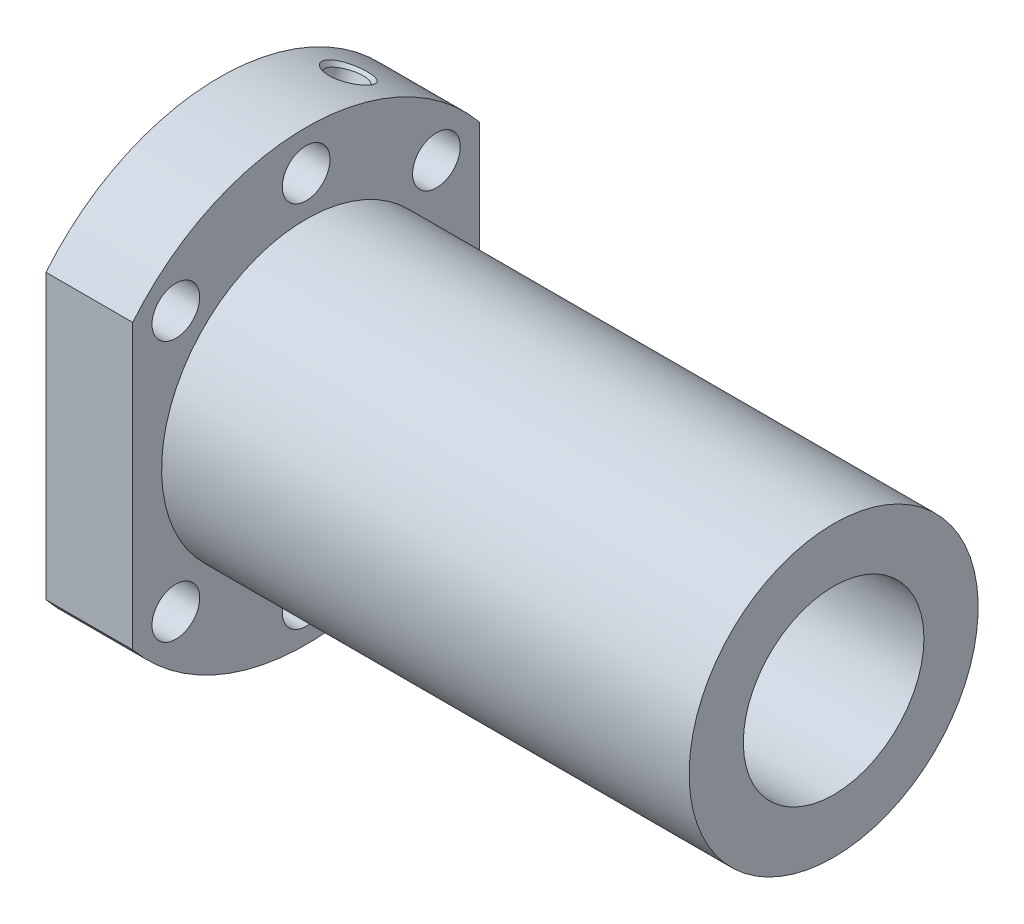
ISO-10303-21;
HEADER;
FILE_DESCRIPTION(('STEP AP214'),'2;1');
FILE_NAME('part.step','',(''),(''),'','','');
FILE_SCHEMA(('AUTOMOTIVE_DESIGN { 1 0 10303 214 1 1 1 1 }'));
ENDSEC;
DATA;
#1=APPLICATION_CONTEXT('core data for automotive mechanical design processes');
#2=APPLICATION_PROTOCOL_DEFINITION('international standard','automotive_design',2000,#1);
#3=PRODUCT_CONTEXT('',#1,'mechanical');
#4=PRODUCT('Part','Part','',(#3));
#5=PRODUCT_RELATED_PRODUCT_CATEGORY('part','',(#4));
#6=PRODUCT_DEFINITION_FORMATION('','',#4);
#7=PRODUCT_DEFINITION_CONTEXT('part definition',#1,'design');
#8=PRODUCT_DEFINITION('design','',#6,#7);
#9=PRODUCT_DEFINITION_SHAPE('','',#8);
#10=(LENGTH_UNIT() NAMED_UNIT(*) SI_UNIT(.MILLI.,.METRE.));
#11=(NAMED_UNIT(*) PLANE_ANGLE_UNIT() SI_UNIT($,.RADIAN.));
#12=(NAMED_UNIT(*) SI_UNIT($,.STERADIAN.) SOLID_ANGLE_UNIT());
#13=UNCERTAINTY_MEASURE_WITH_UNIT(LENGTH_MEASURE(1.E-05),#10,'distance_accuracy_value','');
#14=(GEOMETRIC_REPRESENTATION_CONTEXT(3) GLOBAL_UNCERTAINTY_ASSIGNED_CONTEXT((#13)) GLOBAL_UNIT_ASSIGNED_CONTEXT((#10,
#11,#12)) REPRESENTATION_CONTEXT('',''));
#15=CARTESIAN_POINT('',(0.,0.,0.));
#16=DIRECTION('',(0.,0.,1.));
#17=DIRECTION('',(1.,0.,0.));
#18=AXIS2_PLACEMENT_3D('',#15,#16,#17);
#19=CARTESIAN_POINT('',(0.,0.,0.));
#20=DIRECTION('',(1.,0.,0.));
#21=DIRECTION('',(0.,-1.,0.));
#22=AXIS2_PLACEMENT_3D('',#19,#20,#21);
#23=CYLINDRICAL_SURFACE('',#22,31.);
#24=CARTESIAN_POINT('',(0.,0.,0.));
#25=DIRECTION('',(1.,0.,0.));
#26=DIRECTION('',(0.,-1.,0.));
#27=AXIS2_PLACEMENT_3D('',#24,#25,#26);
#28=CIRCLE('',#27,31.);
#29=CARTESIAN_POINT('',(0.,19.6214168703486,-24.));
#30=VERTEX_POINT('',#29);
#31=CARTESIAN_POINT('',(0.,19.6214168703486,24.));
#32=VERTEX_POINT('',#31);
#33=EDGE_CURVE('E89',#30,#32,#28,.T.);
#34=ORIENTED_EDGE('',*,*,#33,.T.);
#35=DIRECTION('',(1.,0.,0.));
#36=VECTOR('',#35,1.);
#37=CARTESIAN_POINT('',(0.,19.6214168703486,24.));
#38=LINE('',#37,#36);
#39=CARTESIAN_POINT('',(12.,19.6214168703486,24.));
#40=VERTEX_POINT('',#39);
#41=EDGE_CURVE('E113',#32,#40,#38,.T.);
#42=ORIENTED_EDGE('',*,*,#41,.T.);
#43=CARTESIAN_POINT('',(12.,0.,0.));
#44=DIRECTION('',(-1.,0.,0.));
#45=DIRECTION('',(0.,-1.,0.));
#46=AXIS2_PLACEMENT_3D('',#43,#44,#45);
#47=CIRCLE('',#46,31.);
#48=CARTESIAN_POINT('',(12.,19.6214168703486,-24.));
#49=VERTEX_POINT('',#48);
#50=EDGE_CURVE('E80',#40,#49,#47,.T.);
#51=ORIENTED_EDGE('',*,*,#50,.T.);
#52=DIRECTION('',(1.,0.,0.));
#53=VECTOR('',#52,1.);
#54=CARTESIAN_POINT('',(0.,19.6214168703486,-24.));
#55=LINE('',#54,#53);
#56=EDGE_CURVE('E79',#49,#30,#55,.F.);
#57=ORIENTED_EDGE('',*,*,#56,.T.);
#58=EDGE_LOOP('',(#34,#42,#51,#57));
#59=FACE_BOUND('',#58,.T.);
#60=CARTESIAN_POINT('',(3.73391342266617,27.8690269486226,-13.5763521220967));
#61=CARTESIAN_POINT('',(3.83172039945811,27.8217427268872,-13.6734156455103));
#62=CARTESIAN_POINT('',(3.93764096271412,27.7771449125141,-13.7636744667535));
#63=CARTESIAN_POINT('',(4.16311193954464,27.6945830576614,-13.9290573607886));
#64=CARTESIAN_POINT('',(4.2826752949233,27.6566254040687,-14.004166872612));
#65=CARTESIAN_POINT('',(4.55093773970761,27.5834506969795,-14.1478156487867));
#66=CARTESIAN_POINT('',(4.70134328426315,27.5494398722502,-14.2138008167163));
#67=CARTESIAN_POINT('',(5.01220614490992,27.4927870995901,-14.3230744502846));
#68=CARTESIAN_POINT('',(5.17266645855808,27.4701485603092,-14.3663561111033));
#69=CARTESIAN_POINT('',(5.50471594787177,27.4365077497302,-14.4305030147486));
#70=CARTESIAN_POINT('',(5.6764974818161,27.4259106734008,-14.4505880326188));
#71=CARTESIAN_POINT('',(6.02145222803602,27.4181119018361,-14.4653796632794));
#72=CARTESIAN_POINT('',(6.19462554514195,27.4209112252506,-14.4600843461726));
#73=CARTESIAN_POINT('',(6.540164523449,27.4399423293176,-14.4239380076328));
#74=CARTESIAN_POINT('',(6.71247982940147,27.4563733522753,-14.3927079142236));
#75=CARTESIAN_POINT('',(7.04868564033678,27.5022897624869,-14.3047719169861));
#76=CARTESIAN_POINT('',(7.21257589870152,27.5317755316368,-14.2480652678805));
#77=CARTESIAN_POINT('',(7.5258984684216,27.6023929635506,-14.110768717611));
#78=CARTESIAN_POINT('',(7.67542540471292,27.6434402200817,-14.0303517249871));
#79=CARTESIAN_POINT('',(7.95661480925634,27.7356601147963,-13.8471525774228));
#80=CARTESIAN_POINT('',(8.08827967722708,27.786831390571,-13.7443734316153));
#81=CARTESIAN_POINT('',(8.32565921154788,27.8956160005066,-13.5221824286205));
#82=CARTESIAN_POINT('',(8.43202783431556,27.9529931942332,-13.4033544407289));
#83=CARTESIAN_POINT('',(8.6199031964565,28.0731503764994,-13.1498230837405));
#84=CARTESIAN_POINT('',(8.70141729521203,28.1359287586833,-13.0151244303304));
#85=CARTESIAN_POINT('',(8.83335673437873,28.2615290363212,-12.7400071852096));
#86=CARTESIAN_POINT('',(8.88502270875595,28.3242202334511,-12.6001238085929));
#87=CARTESIAN_POINT('',(8.96081737702909,28.4500823807635,-12.3132975280548));
#88=CARTESIAN_POINT('',(8.98495351274126,28.5132531966461,-12.166356543131));
#89=CARTESIAN_POINT('',(9.00435024300081,28.6355290750747,-11.8756217854069));
#90=CARTESIAN_POINT('',(9.00068915906042,28.6946969630847,-11.7319253716037));
#91=CARTESIAN_POINT('',(8.96718126513508,28.8098145700563,-11.4463220456581));
#92=CARTESIAN_POINT('',(8.9373365111654,28.8657645413301,-11.3044149938975));
#93=CARTESIAN_POINT('',(8.85292278904339,28.972622344302,-11.0276472382687));
#94=CARTESIAN_POINT('',(8.79855954640585,29.0235679197214,-10.892738112944));
#95=CARTESIAN_POINT('',(8.66705318408687,29.1199465697369,-10.6324035318046));
#96=CARTESIAN_POINT('',(8.58990778553378,29.1653790922272,-10.5069790263021));
#97=CARTESIAN_POINT('',(8.41302610302288,29.2511747926264,-10.265749352136));
#98=CARTESIAN_POINT('',(8.31275368872246,29.291375087955,-10.1502798708712));
#99=CARTESIAN_POINT('',(8.09391269533455,29.3648736123685,-9.935647750919));
#100=CARTESIAN_POINT('',(7.97534051393354,29.3981704794812,-9.83648833082736));
#101=CARTESIAN_POINT('',(7.71770459987976,29.4589828146092,-9.65288122146302));
#102=CARTESIAN_POINT('',(7.57797036519608,29.4861807953724,-9.56926917018498));
#103=CARTESIAN_POINT('',(7.28616587746626,29.532803868801,-9.42439949154874));
#104=CARTESIAN_POINT('',(7.1340931624851,29.5522274055976,-9.36314633900453));
#105=CARTESIAN_POINT('',(6.81545710843501,29.5839413695606,-9.26246905279615));
#106=CARTESIAN_POINT('',(6.64855833488234,29.5959185817919,-9.22400627861977));
#107=CARTESIAN_POINT('',(6.31040813685766,29.6115384062477,-9.17373915479975));
#108=CARTESIAN_POINT('',(6.13915610995701,29.6151798585021,-9.16193851535164));
#109=CARTESIAN_POINT('',(5.79321895526651,29.6141319433988,-9.16532597792809));
#110=CARTESIAN_POINT('',(5.61853978609192,29.6092604737786,-9.18110402494554));
#111=CARTESIAN_POINT('',(5.2744130861021,29.5908081791866,-9.24040165479549));
#112=CARTESIAN_POINT('',(5.1049658358506,29.5772268879944,-9.283922722659));
#113=CARTESIAN_POINT('',(4.77621046409721,29.5413054962817,-9.39759565054583));
#114=CARTESIAN_POINT('',(4.61690259416074,29.5189651785417,-9.46774817101442));
#115=CARTESIAN_POINT('',(4.31328219034027,29.4655041095307,-9.63283775799229));
#116=CARTESIAN_POINT('',(4.16896854432141,29.4343840101008,-9.7277729845091));
#117=CARTESIAN_POINT('',(3.90309088051014,29.3642663115271,-9.93739236655099));
#118=CARTESIAN_POINT('',(3.78108713460152,29.3254622362862,-10.0515827493378));
#119=CARTESIAN_POINT('',(3.56010199706259,29.2398833407932,-10.2978717269987));
#120=CARTESIAN_POINT('',(3.46111474840867,29.1931105536056,-10.4299657523477));
#121=CARTESIAN_POINT('',(3.29348106070137,29.0943974404276,-10.7021532222309));
#122=CARTESIAN_POINT('',(3.22373498453029,29.0427566320894,-10.8416777322431));
#123=CARTESIAN_POINT('',(3.11143602830743,28.933798565096,-11.1291904234475));
#124=CARTESIAN_POINT('',(3.06887421322508,28.8764831787451,-11.2771758062445));
#125=CARTESIAN_POINT('',(3.01387894347544,28.7602451226841,-11.5703098243668));
#126=CARTESIAN_POINT('',(3.00020691575286,28.7015029595824,-11.7152985767022));
#127=CARTESIAN_POINT('',(2.99979784467293,28.5817894805479,-12.0044064640103));
#128=CARTESIAN_POINT('',(3.01306089478222,28.5208181568804,-12.1485255959636));
#129=CARTESIAN_POINT('',(3.06548816901832,28.399737918114,-12.4289092517504));
#130=CARTESIAN_POINT('',(3.10414693668251,28.3396351049669,-12.5652717405949));
#131=CARTESIAN_POINT('',(3.20546962715837,28.2210400323666,-12.829413294532));
#132=CARTESIAN_POINT('',(3.26811769544351,28.1625467364925,-12.9571979632882));
#133=CARTESIAN_POINT('',(3.39587994579734,28.0639849535146,-13.1690024524421));
#134=CARTESIAN_POINT('',(3.45601975685166,28.0231140452032,-13.255698665842));
#135=CARTESIAN_POINT('',(3.58712006065087,27.9439664940703,-13.4217430390521));
#136=CARTESIAN_POINT('',(3.65807787019119,27.9056892113391,-13.5010930131387));
#137=CARTESIAN_POINT('',(3.73391342266617,27.8690269486226,-13.5763521220967));
#138=B_SPLINE_CURVE_WITH_KNOTS('',3,(#60,#61,#62,#63,#64,#65,#66,#67,#68,#69,#70,#71,#72,#73,
#74,#75,#76,#77,#78,#79,#80,#81,#82,#83,#84,#85,#86,#87,#88,#89,#90,#91,#92,#93,#94,#95,#96,#97,
#98,#99,#100,#101,#102,#103,#104,#105,#106,#107,#108,#109,#110,#111,#112,#113,#114,#115,#116,
#117,#118,#119,#120,#121,#122,#123,#124,#125,#126,#127,#128,#129,#130,#131,#132,#133,#134,#135,
#136,#137),.UNSPECIFIED.,.T.,.F.,(4,2,2,2,2,2,2,2,2,2,2,2,2,2,2,2,2,2,2,2,2,2,2,2,2,2,2,2,2,2,2,
2,2,2,2,2,2,2,4),(0.,0.436724120356918,0.8738660245217,1.37473559316676,1.87575519953802,
2.39317655065499,2.91063724663786,3.43579725974314,3.960972636595,4.48240908220212,
5.00377540476875,5.5096750970179,6.01542484743567,6.49827293533708,6.98099046965944,
7.44508069157707,7.90913447508877,8.36936497802254,8.82964153286262,9.30190801532278,
9.77426758240875,10.2673373444839,10.7605057333892,11.2732197741387,11.7860051577203,
12.3098943496746,12.8338115867735,13.3577418175782,13.8816331602309,14.3937072739822,
14.9056509369287,15.396094439117,15.8863766573239,16.3551733125184,16.8239715944735,
17.2837110042904,17.7431470953284,18.081849091333,18.4204672148322),.UNSPECIFIED.);
#139=CARTESIAN_POINT('',(3.73391342266617,27.8690269486226,-13.5763521220967));
#140=VERTEX_POINT('',#139);
#141=EDGE_CURVE('E11',#140,#140,#138,.T.);
#142=ORIENTED_EDGE('',*,*,#141,.T.);
#143=EDGE_LOOP('',(#142));
#144=FACE_BOUND('',#143,.T.);
#145=ADVANCED_FACE('F17',(#59,#144),#23,.T.);
#146=CARTESIAN_POINT('',(12.,-19.6214168703486,-24.));
#147=VERTEX_POINT('',#146);
#148=CARTESIAN_POINT('',(12.,-19.6214168703486,24.));
#149=VERTEX_POINT('',#148);
#150=EDGE_CURVE('E103',#147,#149,#47,.T.);
#151=ORIENTED_EDGE('',*,*,#150,.T.);
#152=DIRECTION('',(1.,0.,0.));
#153=VECTOR('',#152,1.);
#154=CARTESIAN_POINT('',(0.,-19.6214168703486,24.));
#155=LINE('',#154,#153);
#156=CARTESIAN_POINT('',(0.,-19.6214168703486,24.));
#157=VERTEX_POINT('',#156);
#158=EDGE_CURVE('E95',#149,#157,#155,.F.);
#159=ORIENTED_EDGE('',*,*,#158,.T.);
#160=CARTESIAN_POINT('',(0.,-19.6214168703486,-24.));
#161=VERTEX_POINT('',#160);
#162=EDGE_CURVE('E87',#157,#161,#28,.T.);
#163=ORIENTED_EDGE('',*,*,#162,.T.);
#164=DIRECTION('',(1.,0.,0.));
#165=VECTOR('',#164,1.);
#166=CARTESIAN_POINT('',(0.,-19.6214168703486,-24.));
#167=LINE('',#166,#165);
#168=EDGE_CURVE('E69',#161,#147,#167,.T.);
#169=ORIENTED_EDGE('',*,*,#168,.T.);
#170=EDGE_LOOP('',(#151,#159,#163,#169));
#171=FACE_BOUND('',#170,.T.);
#172=ADVANCED_FACE('F94',(#171),#23,.T.);
#173=CARTESIAN_POINT('',(12.,0.,0.));
#174=DIRECTION('',(1.,0.,0.));
#175=DIRECTION('',(0.,0.,-1.));
#176=AXIS2_PLACEMENT_3D('',#173,#174,#175);
#177=PLANE('',#176);
#178=CARTESIAN_POINT('',(12.,-18.031222920257,-18.031222920257));
#179=DIRECTION('',(1.,0.,0.));
#180=DIRECTION('',(0.,0.,-1.));
#181=AXIS2_PLACEMENT_3D('',#178,#179,#180);
#182=CIRCLE('',#181,3.3);
#183=CARTESIAN_POINT('',(12.,-18.031222920257,-21.331222920257));
#184=VERTEX_POINT('',#183);
#185=EDGE_CURVE('E146',#184,#184,#182,.T.);
#186=ORIENTED_EDGE('',*,*,#185,.F.);
#187=EDGE_LOOP('',(#186));
#188=FACE_BOUND('',#187,.T.);
#189=CARTESIAN_POINT('',(12.,-25.5,0.));
#190=DIRECTION('',(1.,0.,0.));
#191=DIRECTION('',(0.,0.,-1.));
#192=AXIS2_PLACEMENT_3D('',#189,#190,#191);
#193=CIRCLE('',#192,3.3);
#194=CARTESIAN_POINT('',(12.,-25.5,-3.3));
#195=VERTEX_POINT('',#194);
#196=EDGE_CURVE('E142',#195,#195,#193,.T.);
#197=ORIENTED_EDGE('',*,*,#196,.F.);
#198=EDGE_LOOP('',(#197));
#199=FACE_BOUND('',#198,.T.);
#200=CARTESIAN_POINT('',(12.,-18.031222920257,18.031222920257));
#201=DIRECTION('',(1.,0.,0.));
#202=DIRECTION('',(0.,0.,-1.));
#203=AXIS2_PLACEMENT_3D('',#200,#201,#202);
#204=CIRCLE('',#203,3.3);
#205=CARTESIAN_POINT('',(12.,-18.031222920257,14.7312229202569));
#206=VERTEX_POINT('',#205);
#207=EDGE_CURVE('E137',#206,#206,#204,.T.);
#208=ORIENTED_EDGE('',*,*,#207,.F.);
#209=EDGE_LOOP('',(#208));
#210=FACE_BOUND('',#209,.T.);
#211=CARTESIAN_POINT('',(12.,18.031222920257,18.031222920257));
#212=DIRECTION('',(1.,0.,0.));
#213=DIRECTION('',(0.,0.,-1.));
#214=AXIS2_PLACEMENT_3D('',#211,#212,#213);
#215=CIRCLE('',#214,3.3);
#216=CARTESIAN_POINT('',(12.,18.031222920257,14.7312229202569));
#217=VERTEX_POINT('',#216);
#218=EDGE_CURVE('E133',#217,#217,#215,.T.);
#219=ORIENTED_EDGE('',*,*,#218,.F.);
#220=EDGE_LOOP('',(#219));
#221=FACE_BOUND('',#220,.T.);
#222=CARTESIAN_POINT('',(12.,25.5,0.));
#223=DIRECTION('',(1.,0.,0.));
#224=DIRECTION('',(0.,0.,-1.));
#225=AXIS2_PLACEMENT_3D('',#222,#223,#224);
#226=CIRCLE('',#225,3.3);
#227=CARTESIAN_POINT('',(12.,25.5,-3.3));
#228=VERTEX_POINT('',#227);
#229=EDGE_CURVE('E128',#228,#228,#226,.T.);
#230=ORIENTED_EDGE('',*,*,#229,.F.);
#231=EDGE_LOOP('',(#230));
#232=FACE_BOUND('',#231,.T.);
#233=CARTESIAN_POINT('',(12.,18.031222920257,-18.031222920257));
#234=DIRECTION('',(1.,0.,0.));
#235=DIRECTION('',(0.,0.,-1.));
#236=AXIS2_PLACEMENT_3D('',#233,#234,#235);
#237=CIRCLE('',#236,3.3);
#238=CARTESIAN_POINT('',(12.,18.031222920257,-21.331222920257));
#239=VERTEX_POINT('',#238);
#240=EDGE_CURVE('E123',#239,#239,#237,.T.);
#241=ORIENTED_EDGE('',*,*,#240,.F.);
#242=EDGE_LOOP('',(#241));
#243=FACE_BOUND('',#242,.T.);
#244=CARTESIAN_POINT('',(12.,0.,0.));
#245=DIRECTION('',(1.,0.,0.));
#246=DIRECTION('',(0.,0.,-1.));
#247=AXIS2_PLACEMENT_3D('',#244,#245,#246);
#248=CIRCLE('',#247,20.);
#249=CARTESIAN_POINT('',(12.,0.,-20.));
#250=VERTEX_POINT('',#249);
#251=EDGE_CURVE('E30',#250,#250,#248,.T.);
#252=ORIENTED_EDGE('',*,*,#251,.F.);
#253=EDGE_LOOP('',(#252));
#254=FACE_BOUND('',#253,.T.);
#255=ORIENTED_EDGE('',*,*,#50,.F.);
#256=DIRECTION('',(0.,-1.,0.));
#257=VECTOR('',#256,1.);
#258=CARTESIAN_POINT('',(12.,0.,24.));
#259=LINE('',#258,#257);
#260=EDGE_CURVE('E51',#40,#149,#259,.T.);
#261=ORIENTED_EDGE('',*,*,#260,.T.);
#262=ORIENTED_EDGE('',*,*,#150,.F.);
#263=DIRECTION('',(0.,1.,0.));
#264=VECTOR('',#263,1.);
#265=CARTESIAN_POINT('',(12.,0.,-24.));
#266=LINE('',#265,#264);
#267=EDGE_CURVE('E41',#147,#49,#266,.T.);
#268=ORIENTED_EDGE('',*,*,#267,.T.);
#269=EDGE_LOOP('',(#255,#261,#262,#268));
#270=FACE_BOUND('',#269,.T.);
#271=ADVANCED_FACE('F199',(#188,#199,#210,#221,#232,#243,#254,#270),#177,.T.);
#272=CARTESIAN_POINT('',(0.,0.,0.));
#273=DIRECTION('',(-1.,0.,0.));
#274=DIRECTION('',(0.,0.,1.));
#275=AXIS2_PLACEMENT_3D('',#272,#273,#274);
#276=PLANE('',#275);
#277=CARTESIAN_POINT('',(0.,-18.031222920257,-18.031222920257));
#278=DIRECTION('',(-1.,0.,0.));
#279=DIRECTION('',(0.,0.,1.));
#280=AXIS2_PLACEMENT_3D('',#277,#278,#279);
#281=CIRCLE('',#280,3.3);
#282=CARTESIAN_POINT('',(0.,-18.031222920257,-14.7312229202569));
#283=VERTEX_POINT('',#282);
#284=EDGE_CURVE('E147',#283,#283,#281,.T.);
#285=ORIENTED_EDGE('',*,*,#284,.F.);
#286=EDGE_LOOP('',(#285));
#287=FACE_BOUND('',#286,.T.);
#288=CARTESIAN_POINT('',(0.,-25.5,0.));
#289=DIRECTION('',(-1.,0.,0.));
#290=DIRECTION('',(0.,0.,1.));
#291=AXIS2_PLACEMENT_3D('',#288,#289,#290);
#292=CIRCLE('',#291,3.3);
#293=CARTESIAN_POINT('',(0.,-25.5,3.3));
#294=VERTEX_POINT('',#293);
#295=EDGE_CURVE('E143',#294,#294,#292,.T.);
#296=ORIENTED_EDGE('',*,*,#295,.F.);
#297=EDGE_LOOP('',(#296));
#298=FACE_BOUND('',#297,.T.);
#299=CARTESIAN_POINT('',(0.,-18.031222920257,18.031222920257));
#300=DIRECTION('',(-1.,0.,0.));
#301=DIRECTION('',(0.,0.,1.));
#302=AXIS2_PLACEMENT_3D('',#299,#300,#301);
#303=CIRCLE('',#302,3.3);
#304=CARTESIAN_POINT('',(0.,-18.031222920257,21.331222920257));
#305=VERTEX_POINT('',#304);
#306=EDGE_CURVE('E138',#305,#305,#303,.T.);
#307=ORIENTED_EDGE('',*,*,#306,.F.);
#308=EDGE_LOOP('',(#307));
#309=FACE_BOUND('',#308,.T.);
#310=CARTESIAN_POINT('',(0.,18.031222920257,18.031222920257));
#311=DIRECTION('',(-1.,0.,0.));
#312=DIRECTION('',(0.,0.,1.));
#313=AXIS2_PLACEMENT_3D('',#310,#311,#312);
#314=CIRCLE('',#313,3.3);
#315=CARTESIAN_POINT('',(0.,18.031222920257,21.331222920257));
#316=VERTEX_POINT('',#315);
#317=EDGE_CURVE('E134',#316,#316,#314,.T.);
#318=ORIENTED_EDGE('',*,*,#317,.F.);
#319=EDGE_LOOP('',(#318));
#320=FACE_BOUND('',#319,.T.);
#321=CARTESIAN_POINT('',(0.,25.5,0.));
#322=DIRECTION('',(-1.,0.,0.));
#323=DIRECTION('',(0.,0.,1.));
#324=AXIS2_PLACEMENT_3D('',#321,#322,#323);
#325=CIRCLE('',#324,3.3);
#326=CARTESIAN_POINT('',(0.,25.5,3.3));
#327=VERTEX_POINT('',#326);
#328=EDGE_CURVE('E129',#327,#327,#325,.T.);
#329=ORIENTED_EDGE('',*,*,#328,.F.);
#330=EDGE_LOOP('',(#329));
#331=FACE_BOUND('',#330,.T.);
#332=CARTESIAN_POINT('',(0.,18.031222920257,-18.031222920257));
#333=DIRECTION('',(-1.,0.,0.));
#334=DIRECTION('',(0.,0.,1.));
#335=AXIS2_PLACEMENT_3D('',#332,#333,#334);
#336=CIRCLE('',#335,3.3);
#337=CARTESIAN_POINT('',(0.,18.031222920257,-14.7312229202569));
#338=VERTEX_POINT('',#337);
#339=EDGE_CURVE('E124',#338,#338,#336,.T.);
#340=ORIENTED_EDGE('',*,*,#339,.F.);
#341=EDGE_LOOP('',(#340));
#342=FACE_BOUND('',#341,.T.);
#343=CARTESIAN_POINT('',(0.,0.,0.));
#344=DIRECTION('',(-1.,0.,0.));
#345=DIRECTION('',(0.,0.,1.));
#346=AXIS2_PLACEMENT_3D('',#343,#344,#345);
#347=CIRCLE('',#346,12.5);
#348=CARTESIAN_POINT('',(0.,0.,12.5));
#349=VERTEX_POINT('',#348);
#350=EDGE_CURVE('E122',#349,#349,#347,.T.);
#351=ORIENTED_EDGE('',*,*,#350,.F.);
#352=EDGE_LOOP('',(#351));
#353=FACE_BOUND('',#352,.T.);
#354=ORIENTED_EDGE('',*,*,#162,.F.);
#355=DIRECTION('',(0.,1.,0.));
#356=VECTOR('',#355,1.);
#357=CARTESIAN_POINT('',(0.,0.,24.));
#358=LINE('',#357,#356);
#359=EDGE_CURVE('E105',#157,#32,#358,.T.);
#360=ORIENTED_EDGE('',*,*,#359,.T.);
#361=ORIENTED_EDGE('',*,*,#33,.F.);
#362=DIRECTION('',(0.,-1.,0.));
#363=VECTOR('',#362,1.);
#364=CARTESIAN_POINT('',(0.,0.,-24.));
#365=LINE('',#364,#363);
#366=EDGE_CURVE('E72',#30,#161,#365,.T.);
#367=ORIENTED_EDGE('',*,*,#366,.T.);
#368=EDGE_LOOP('',(#354,#360,#361,#367));
#369=FACE_BOUND('',#368,.T.);
#370=ADVANCED_FACE('F85',(#287,#298,#309,#320,#331,#342,#353,#369),#276,.T.);
#371=CARTESIAN_POINT('',(6.,0.,-24.));
#372=DIRECTION('',(0.,0.,-1.));
#373=DIRECTION('',(-1.,0.,0.));
#374=AXIS2_PLACEMENT_3D('',#371,#372,#373);
#375=PLANE('',#374);
#376=ORIENTED_EDGE('',*,*,#56,.F.);
#377=ORIENTED_EDGE('',*,*,#267,.F.);
#378=ORIENTED_EDGE('',*,*,#168,.F.);
#379=ORIENTED_EDGE('',*,*,#366,.F.);
#380=EDGE_LOOP('',(#376,#377,#378,#379));
#381=FACE_BOUND('',#380,.T.);
#382=ADVANCED_FACE('F71',(#381),#375,.T.);
#383=CARTESIAN_POINT('',(6.,0.,24.));
#384=DIRECTION('',(0.,0.,1.));
#385=DIRECTION('',(1.,0.,0.));
#386=AXIS2_PLACEMENT_3D('',#383,#384,#385);
#387=PLANE('',#386);
#388=ORIENTED_EDGE('',*,*,#158,.F.);
#389=ORIENTED_EDGE('',*,*,#260,.F.);
#390=ORIENTED_EDGE('',*,*,#41,.F.);
#391=ORIENTED_EDGE('',*,*,#359,.F.);
#392=EDGE_LOOP('',(#388,#389,#390,#391));
#393=FACE_BOUND('',#392,.T.);
#394=ADVANCED_FACE('F224',(#393),#387,.T.);
#395=CARTESIAN_POINT('',(85.,0.,0.));
#396=DIRECTION('',(1.,0.,0.));
#397=DIRECTION('',(0.,0.,-1.));
#398=AXIS2_PLACEMENT_3D('',#395,#396,#397);
#399=PLANE('',#398);
#400=CARTESIAN_POINT('',(85.,0.,0.));
#401=DIRECTION('',(1.,0.,0.));
#402=DIRECTION('',(0.,0.,-1.));
#403=AXIS2_PLACEMENT_3D('',#400,#401,#402);
#404=CIRCLE('',#403,12.5);
#405=CARTESIAN_POINT('',(85.,0.,-12.5));
#406=VERTEX_POINT('',#405);
#407=EDGE_CURVE('E118',#406,#406,#404,.T.);
#408=ORIENTED_EDGE('',*,*,#407,.F.);
#409=EDGE_LOOP('',(#408));
#410=FACE_BOUND('',#409,.T.);
#411=CARTESIAN_POINT('',(85.,0.,0.));
#412=DIRECTION('',(-1.,0.,0.));
#413=DIRECTION('',(0.,-1.,0.));
#414=AXIS2_PLACEMENT_3D('',#411,#412,#413);
#415=CIRCLE('',#414,20.);
#416=CARTESIAN_POINT('',(85.,-20.,0.));
#417=VERTEX_POINT('',#416);
#418=EDGE_CURVE('E91',#417,#417,#415,.T.);
#419=ORIENTED_EDGE('',*,*,#418,.F.);
#420=EDGE_LOOP('',(#419));
#421=FACE_BOUND('',#420,.T.);
#422=ADVANCED_FACE('F233',(#410,#421),#399,.T.);
#423=CARTESIAN_POINT('',(0.,0.,0.));
#424=DIRECTION('',(1.,0.,0.));
#425=DIRECTION('',(0.,-1.,0.));
#426=AXIS2_PLACEMENT_3D('',#423,#424,#425);
#427=CYLINDRICAL_SURFACE('',#426,20.);
#428=ORIENTED_EDGE('',*,*,#251,.T.);
#429=EDGE_LOOP('',(#428));
#430=FACE_BOUND('',#429,.T.);
#431=ORIENTED_EDGE('',*,*,#418,.T.);
#432=EDGE_LOOP('',(#431));
#433=FACE_BOUND('',#432,.T.);
#434=ADVANCED_FACE('F241',(#430,#433),#427,.T.);
#435=CARTESIAN_POINT('',(-1.,0.,0.));
#436=DIRECTION('',(1.,0.,0.));
#437=DIRECTION('',(0.,-1.,0.));
#438=AXIS2_PLACEMENT_3D('',#435,#436,#437);
#439=CYLINDRICAL_SURFACE('',#438,12.5);
#440=ORIENTED_EDGE('',*,*,#350,.T.);
#441=EDGE_LOOP('',(#440));
#442=FACE_BOUND('',#441,.T.);
#443=ORIENTED_EDGE('',*,*,#407,.T.);
#444=EDGE_LOOP('',(#443));
#445=FACE_BOUND('',#444,.T.);
#446=ADVANCED_FACE('F254',(#442,#445),#439,.F.);
#447=CARTESIAN_POINT('',(-1.,18.031222920257,-18.031222920257));
#448=DIRECTION('',(1.,0.,0.));
#449=DIRECTION('',(0.,-0.707106781186548,0.707106781186548));
#450=AXIS2_PLACEMENT_3D('',#447,#448,#449);
#451=CYLINDRICAL_SURFACE('',#450,3.3);
#452=ORIENTED_EDGE('',*,*,#240,.T.);
#453=EDGE_LOOP('',(#452));
#454=FACE_BOUND('',#453,.T.);
#455=ORIENTED_EDGE('',*,*,#339,.T.);
#456=EDGE_LOOP('',(#455));
#457=FACE_BOUND('',#456,.T.);
#458=ADVANCED_FACE('F263',(#454,#457),#451,.F.);
#459=CARTESIAN_POINT('',(-1.,25.5,0.));
#460=DIRECTION('',(1.,0.,0.));
#461=DIRECTION('',(0.,-1.,0.));
#462=AXIS2_PLACEMENT_3D('',#459,#460,#461);
#463=CYLINDRICAL_SURFACE('',#462,3.3);
#464=ORIENTED_EDGE('',*,*,#229,.T.);
#465=EDGE_LOOP('',(#464));
#466=FACE_BOUND('',#465,.T.);
#467=ORIENTED_EDGE('',*,*,#328,.T.);
#468=EDGE_LOOP('',(#467));
#469=FACE_BOUND('',#468,.T.);
#470=ADVANCED_FACE('F272',(#466,#469),#463,.F.);
#471=CARTESIAN_POINT('',(-1.,18.031222920257,18.031222920257));
#472=DIRECTION('',(1.,0.,0.));
#473=DIRECTION('',(0.,-0.707106781186548,-0.707106781186548));
#474=AXIS2_PLACEMENT_3D('',#471,#472,#473);
#475=CYLINDRICAL_SURFACE('',#474,3.3);
#476=ORIENTED_EDGE('',*,*,#218,.T.);
#477=EDGE_LOOP('',(#476));
#478=FACE_BOUND('',#477,.T.);
#479=ORIENTED_EDGE('',*,*,#317,.T.);
#480=EDGE_LOOP('',(#479));
#481=FACE_BOUND('',#480,.T.);
#482=ADVANCED_FACE('F280',(#478,#481),#475,.F.);
#483=CARTESIAN_POINT('',(-1.,-18.031222920257,18.031222920257));
#484=DIRECTION('',(1.,0.,0.));
#485=DIRECTION('',(0.,-0.707106781186548,0.707106781186548));
#486=AXIS2_PLACEMENT_3D('',#483,#484,#485);
#487=CYLINDRICAL_SURFACE('',#486,3.3);
#488=ORIENTED_EDGE('',*,*,#207,.T.);
#489=EDGE_LOOP('',(#488));
#490=FACE_BOUND('',#489,.T.);
#491=ORIENTED_EDGE('',*,*,#306,.T.);
#492=EDGE_LOOP('',(#491));
#493=FACE_BOUND('',#492,.T.);
#494=ADVANCED_FACE('F289',(#490,#493),#487,.F.);
#495=CARTESIAN_POINT('',(-1.,-25.5,0.));
#496=DIRECTION('',(1.,0.,0.));
#497=DIRECTION('',(0.,-1.,0.));
#498=AXIS2_PLACEMENT_3D('',#495,#496,#497);
#499=CYLINDRICAL_SURFACE('',#498,3.3);
#500=ORIENTED_EDGE('',*,*,#196,.T.);
#501=EDGE_LOOP('',(#500));
#502=FACE_BOUND('',#501,.T.);
#503=ORIENTED_EDGE('',*,*,#295,.T.);
#504=EDGE_LOOP('',(#503));
#505=FACE_BOUND('',#504,.T.);
#506=ADVANCED_FACE('F297',(#502,#505),#499,.F.);
#507=CARTESIAN_POINT('',(-1.,-18.031222920257,-18.031222920257));
#508=DIRECTION('',(1.,0.,0.));
#509=DIRECTION('',(0.,-0.707106781186548,-0.707106781186548));
#510=AXIS2_PLACEMENT_3D('',#507,#508,#509);
#511=CYLINDRICAL_SURFACE('',#510,3.3);
#512=ORIENTED_EDGE('',*,*,#185,.T.);
#513=EDGE_LOOP('',(#512));
#514=FACE_BOUND('',#513,.T.);
#515=ORIENTED_EDGE('',*,*,#284,.T.);
#516=EDGE_LOOP('',(#515));
#517=FACE_BOUND('',#516,.T.);
#518=ADVANCED_FACE('F306',(#514,#517),#511,.F.);
#519=CARTESIAN_POINT('',(6.,23.5589280790378,-9.75842752530979));
#520=DIRECTION('',(0.,0.923879532511287,-0.38268343236509));
#521=DIRECTION('',(0.,0.38268343236509,0.923879532511287));
#522=AXIS2_PLACEMENT_3D('',#519,#520,#521);
#523=PLANE('',#522);
#524=CARTESIAN_POINT('',(6.,23.5589280790378,-9.75842752530979));
#525=DIRECTION('',(0.,0.923879532511287,-0.38268343236509));
#526=DIRECTION('',(0.,0.38268343236509,0.923879532511287));
#527=AXIS2_PLACEMENT_3D('',#524,#525,#526);
#528=CIRCLE('',#527,2.45875);
#529=CARTESIAN_POINT('',(6.,24.4998509683655,-7.48683872474766));
#530=VERTEX_POINT('',#529);
#531=EDGE_CURVE('E150',#530,#530,#528,.T.);
#532=ORIENTED_EDGE('',*,*,#531,.T.);
#533=EDGE_LOOP('',(#532));
#534=FACE_BOUND('',#533,.T.);
#535=ADVANCED_FACE('F315',(#534),#523,.T.);
#536=CARTESIAN_POINT('',(6.,29.5641450403612,-12.2458698356829));
#537=DIRECTION('',(0.,0.923879532511287,-0.38268343236509));
#538=DIRECTION('',(0.,0.38268343236509,0.923879532511287));
#539=AXIS2_PLACEMENT_3D('',#536,#537,#538);
#540=CYLINDRICAL_SURFACE('',#539,2.45875);
#541=CARTESIAN_POINT('',(6.,28.1402157108781,-11.6560589955502));
#542=DIRECTION('',(0.,0.923879532511287,-0.38268343236509));
#543=DIRECTION('',(0.,0.38268343236509,0.923879532511287));
#544=AXIS2_PLACEMENT_3D('',#541,#542,#543);
#545=CIRCLE('',#544,2.45875);
#546=CARTESIAN_POINT('',(6.,29.0811386002058,-9.38447019498805));
#547=VERTEX_POINT('',#546);
#548=EDGE_CURVE('E159',#547,#547,#545,.T.);
#549=ORIENTED_EDGE('',*,*,#548,.T.);
#550=EDGE_LOOP('',(#549));
#551=FACE_BOUND('',#550,.T.);
#552=ORIENTED_EDGE('',*,*,#531,.F.);
#553=EDGE_LOOP('',(#552));
#554=FACE_BOUND('',#553,.T.);
#555=ADVANCED_FACE('F323',(#551,#554),#540,.F.);
#556=CARTESIAN_POINT('',(6.,28.1402157108781,-11.6560589955502));
#557=DIRECTION('',(0.,0.923879532511287,-0.38268343236509));
#558=DIRECTION('',(0.,0.38268343236509,0.923879532511287));
#559=AXIS2_PLACEMENT_3D('',#556,#557,#558);
#560=CONICAL_SURFACE('',#559,2.45875,0.785398163397449);
#561=ORIENTED_EDGE('',*,*,#141,.F.);
#562=EDGE_LOOP('',(#561));
#563=FACE_BOUND('',#562,.T.);
#564=ORIENTED_EDGE('',*,*,#548,.F.);
#565=EDGE_LOOP('',(#564));
#566=FACE_BOUND('',#565,.T.);
#567=ADVANCED_FACE('F332',(#563,#566),#560,.F.);
#568=CLOSED_SHELL('',(#145,#172,#271,#370,#382,#394,#422,#434,#446,#458,#470,#482,#494,#506,
#518,#535,#555,#567));
#569=MANIFOLD_SOLID_BREP('B1',#568);
#570=ADVANCED_BREP_SHAPE_REPRESENTATION('',(#18,#569),#14);
#571=SHAPE_DEFINITION_REPRESENTATION(#9,#570);
ENDSEC;
END-ISO-10303-21;
